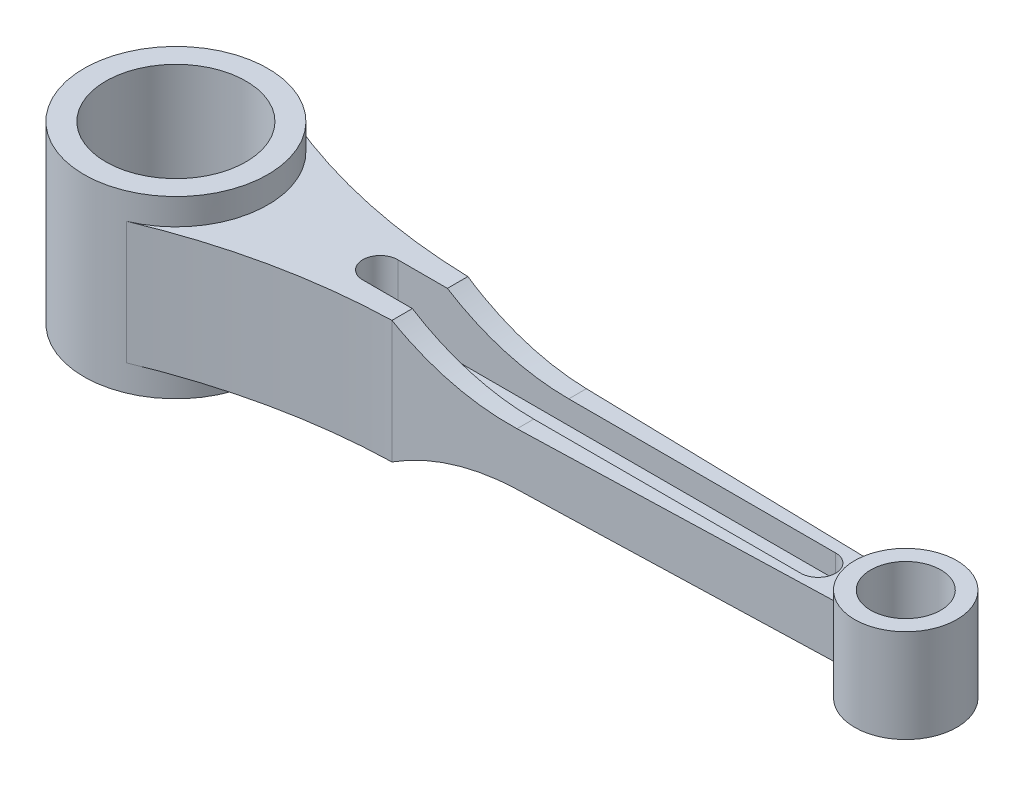
ISO-10303-21;
HEADER;
FILE_DESCRIPTION(('STEP AP214'),'2;1');
FILE_NAME('part.step','',(''),(''),'','','');
FILE_SCHEMA(('AUTOMOTIVE_DESIGN { 1 0 10303 214 1 1 1 1 }'));
ENDSEC;
DATA;
#1=APPLICATION_CONTEXT('core data for automotive mechanical design processes');
#2=APPLICATION_PROTOCOL_DEFINITION('international standard','automotive_design',2000,#1);
#3=PRODUCT_CONTEXT('',#1,'mechanical');
#4=PRODUCT('Part','Part','',(#3));
#5=PRODUCT_RELATED_PRODUCT_CATEGORY('part','',(#4));
#6=PRODUCT_DEFINITION_FORMATION('','',#4);
#7=PRODUCT_DEFINITION_CONTEXT('part definition',#1,'design');
#8=PRODUCT_DEFINITION('design','',#6,#7);
#9=PRODUCT_DEFINITION_SHAPE('','',#8);
#10=(LENGTH_UNIT() NAMED_UNIT(*) SI_UNIT(.MILLI.,.METRE.));
#11=(NAMED_UNIT(*) PLANE_ANGLE_UNIT() SI_UNIT($,.RADIAN.));
#12=(NAMED_UNIT(*) SI_UNIT($,.STERADIAN.) SOLID_ANGLE_UNIT());
#13=UNCERTAINTY_MEASURE_WITH_UNIT(LENGTH_MEASURE(1.E-05),#10,'distance_accuracy_value','');
#14=(GEOMETRIC_REPRESENTATION_CONTEXT(3) GLOBAL_UNCERTAINTY_ASSIGNED_CONTEXT((#13)) GLOBAL_UNIT_ASSIGNED_CONTEXT((#10,
#11,#12)) REPRESENTATION_CONTEXT('',''));
#15=CARTESIAN_POINT('',(0.,0.,0.));
#16=DIRECTION('',(0.,0.,1.));
#17=DIRECTION('',(1.,0.,0.));
#18=AXIS2_PLACEMENT_3D('',#15,#16,#17);
#19=CARTESIAN_POINT('',(0.,9.,-6.));
#20=DIRECTION('',(0.,0.,-1.));
#21=DIRECTION('',(-1.,0.,0.));
#22=AXIS2_PLACEMENT_3D('',#19,#20,#21);
#23=PLANE('',#22);
#24=DIRECTION('',(1.,0.,0.));
#25=VECTOR('',#24,1.);
#26=CARTESIAN_POINT('',(0.,-1.05,-6.));
#27=LINE('',#26,#25);
#28=CARTESIAN_POINT('',(0.,-1.05,-6.));
#29=VERTEX_POINT('',#28);
#30=CARTESIAN_POINT('',(150.,-1.05,-6.));
#31=VERTEX_POINT('',#30);
#32=EDGE_CURVE('E224',#29,#31,#27,.T.);
#33=ORIENTED_EDGE('',*,*,#32,.F.);
#34=DIRECTION('',(0.,-1.,0.));
#35=VECTOR('',#34,1.);
#36=CARTESIAN_POINT('',(0.,21.,-6.));
#37=LINE('',#36,#35);
#38=CARTESIAN_POINT('',(0.,-21.,-6.));
#39=VERTEX_POINT('',#38);
#40=EDGE_CURVE('E282',#29,#39,#37,.T.);
#41=ORIENTED_EDGE('',*,*,#40,.T.);
#42=DIRECTION('',(1.,0.,0.));
#43=VECTOR('',#42,1.);
#44=CARTESIAN_POINT('',(0.,-21.,-6.));
#45=LINE('',#44,#43);
#46=CARTESIAN_POINT('',(17.,-21.,-6.));
#47=VERTEX_POINT('',#46);
#48=EDGE_CURVE('E272',#39,#47,#45,.T.);
#49=ORIENTED_EDGE('',*,*,#48,.T.);
#50=CARTESIAN_POINT('',(58.5692193816531,-87.,-6.));
#51=DIRECTION('',(0.,0.,-1.));
#52=DIRECTION('',(-1.,0.,0.));
#53=AXIS2_PLACEMENT_3D('',#50,#51,#52);
#54=CIRCLE('',#53,78.);
#55=CARTESIAN_POINT('',(58.5692193816531,-9.,-6.));
#56=VERTEX_POINT('',#55);
#57=EDGE_CURVE('E402',#47,#56,#54,.T.);
#58=ORIENTED_EDGE('',*,*,#57,.T.);
#59=DIRECTION('',(1.,0.,0.));
#60=VECTOR('',#59,1.);
#61=CARTESIAN_POINT('',(0.,-9.,-6.));
#62=LINE('',#61,#60);
#63=CARTESIAN_POINT('',(150.,-9.,-6.));
#64=VERTEX_POINT('',#63);
#65=EDGE_CURVE('E334',#56,#64,#62,.T.);
#66=ORIENTED_EDGE('',*,*,#65,.T.);
#67=DIRECTION('',(0.,-1.,0.));
#68=VECTOR('',#67,1.);
#69=CARTESIAN_POINT('',(150.,9.,-6.));
#70=LINE('',#69,#68);
#71=EDGE_CURVE('E354',#31,#64,#70,.T.);
#72=ORIENTED_EDGE('',*,*,#71,.F.);
#73=EDGE_LOOP('',(#33,#41,#49,#58,#66,#72));
#74=FACE_BOUND('',#73,.T.);
#75=ADVANCED_FACE('F45',(#74),#23,.F.);
#76=CARTESIAN_POINT('',(150.,9.,0.));
#77=DIRECTION('',(0.,-1.,0.));
#78=DIRECTION('',(0.,0.,-1.));
#79=AXIS2_PLACEMENT_3D('',#76,#77,#78);
#80=CYLINDRICAL_SURFACE('',#79,6.);
#81=DIRECTION('',(0.,-1.,0.));
#82=VECTOR('',#81,1.);
#83=CARTESIAN_POINT('',(150.,9.,6.));
#84=LINE('',#83,#82);
#85=CARTESIAN_POINT('',(150.,-1.05,6.));
#86=VERTEX_POINT('',#85);
#87=CARTESIAN_POINT('',(150.,-9.,6.));
#88=VERTEX_POINT('',#87);
#89=EDGE_CURVE('E351',#86,#88,#84,.T.);
#90=ORIENTED_EDGE('',*,*,#89,.F.);
#91=CARTESIAN_POINT('',(150.,-1.05,0.));
#92=DIRECTION('',(0.,1.,0.));
#93=DIRECTION('',(0.,0.,1.));
#94=AXIS2_PLACEMENT_3D('',#91,#92,#93);
#95=CIRCLE('',#94,6.);
#96=EDGE_CURVE('E220',#86,#31,#95,.T.);
#97=ORIENTED_EDGE('',*,*,#96,.T.);
#98=ORIENTED_EDGE('',*,*,#71,.T.);
#99=CARTESIAN_POINT('',(150.,-9.,0.));
#100=DIRECTION('',(0.,1.,0.));
#101=DIRECTION('',(0.,0.,1.));
#102=AXIS2_PLACEMENT_3D('',#99,#100,#101);
#103=CIRCLE('',#102,6.);
#104=EDGE_CURVE('E337',#88,#64,#103,.T.);
#105=ORIENTED_EDGE('',*,*,#104,.F.);
#106=EDGE_LOOP('',(#90,#97,#98,#105));
#107=FACE_BOUND('',#106,.T.);
#108=ADVANCED_FACE('F458',(#107),#80,.F.);
#109=CARTESIAN_POINT('',(0.,9.,6.));
#110=DIRECTION('',(0.,0.,-1.));
#111=DIRECTION('',(-1.,0.,0.));
#112=AXIS2_PLACEMENT_3D('',#109,#110,#111);
#113=PLANE('',#112);
#114=DIRECTION('',(0.,-1.,0.));
#115=VECTOR('',#114,1.);
#116=CARTESIAN_POINT('',(0.,21.,6.));
#117=LINE('',#116,#115);
#118=CARTESIAN_POINT('',(0.,-1.04999999999999,6.));
#119=VERTEX_POINT('',#118);
#120=CARTESIAN_POINT('',(0.,-21.,6.));
#121=VERTEX_POINT('',#120);
#122=EDGE_CURVE('E189',#119,#121,#117,.T.);
#123=ORIENTED_EDGE('',*,*,#122,.F.);
#124=DIRECTION('',(1.,0.,0.));
#125=VECTOR('',#124,1.);
#126=CARTESIAN_POINT('',(0.,-1.05,6.));
#127=LINE('',#126,#125);
#128=EDGE_CURVE('E216',#119,#86,#127,.T.);
#129=ORIENTED_EDGE('',*,*,#128,.T.);
#130=ORIENTED_EDGE('',*,*,#89,.T.);
#131=DIRECTION('',(1.,0.,0.));
#132=VECTOR('',#131,1.);
#133=CARTESIAN_POINT('',(0.,-9.,6.));
#134=LINE('',#133,#132);
#135=CARTESIAN_POINT('',(58.5692193816531,-9.,6.));
#136=VERTEX_POINT('',#135);
#137=EDGE_CURVE('E341',#136,#88,#134,.T.);
#138=ORIENTED_EDGE('',*,*,#137,.F.);
#139=CARTESIAN_POINT('',(58.5692193816531,-87.,6.));
#140=DIRECTION('',(0.,0.,-1.));
#141=DIRECTION('',(-1.,0.,0.));
#142=AXIS2_PLACEMENT_3D('',#139,#140,#141);
#143=CIRCLE('',#142,78.);
#144=CARTESIAN_POINT('',(17.,-21.,6.));
#145=VERTEX_POINT('',#144);
#146=EDGE_CURVE('E399',#136,#145,#143,.F.);
#147=ORIENTED_EDGE('',*,*,#146,.T.);
#148=DIRECTION('',(1.,0.,0.));
#149=VECTOR('',#148,1.);
#150=CARTESIAN_POINT('',(0.,-21.,6.));
#151=LINE('',#150,#149);
#152=EDGE_CURVE('E263',#121,#145,#151,.T.);
#153=ORIENTED_EDGE('',*,*,#152,.F.);
#154=EDGE_LOOP('',(#123,#129,#130,#138,#147,#153));
#155=FACE_BOUND('',#154,.T.);
#156=ADVANCED_FACE('F467',(#155),#113,.T.);
#157=CARTESIAN_POINT('',(0.,21.,0.));
#158=DIRECTION('',(0.,-1.,0.));
#159=DIRECTION('',(0.,0.,-1.));
#160=AXIS2_PLACEMENT_3D('',#157,#158,#159);
#161=CYLINDRICAL_SURFACE('',#160,6.);
#162=ORIENTED_EDGE('',*,*,#40,.F.);
#163=CARTESIAN_POINT('',(0.,-1.05,0.));
#164=DIRECTION('',(0.,1.,0.));
#165=DIRECTION('',(0.,0.,1.));
#166=AXIS2_PLACEMENT_3D('',#163,#164,#165);
#167=CIRCLE('',#166,6.);
#168=EDGE_CURVE('E201',#29,#119,#167,.T.);
#169=ORIENTED_EDGE('',*,*,#168,.T.);
#170=ORIENTED_EDGE('',*,*,#122,.T.);
#171=CARTESIAN_POINT('',(0.,-21.,0.));
#172=DIRECTION('',(0.,1.,0.));
#173=DIRECTION('',(0.,0.,1.));
#174=AXIS2_PLACEMENT_3D('',#171,#172,#173);
#175=CIRCLE('',#174,6.);
#176=EDGE_CURVE('E268',#39,#121,#175,.T.);
#177=ORIENTED_EDGE('',*,*,#176,.F.);
#178=EDGE_LOOP('',(#162,#169,#170,#177));
#179=FACE_BOUND('',#178,.T.);
#180=ADVANCED_FACE('F471',(#179),#161,.F.);
#181=CARTESIAN_POINT('',(180.,-16.,0.));
#182=DIRECTION('',(0.,1.,0.));
#183=DIRECTION('',(0.,0.,1.));
#184=AXIS2_PLACEMENT_3D('',#181,#182,#183);
#185=CYLINDRICAL_SURFACE('',#184,12.);
#186=CARTESIAN_POINT('',(180.,-16.,0.));
#187=DIRECTION('',(0.,1.,0.));
#188=DIRECTION('',(0.,0.,1.));
#189=AXIS2_PLACEMENT_3D('',#186,#187,#188);
#190=CIRCLE('',#189,12.);
#191=CARTESIAN_POINT('',(180.,-16.,12.));
#192=VERTEX_POINT('',#191);
#193=EDGE_CURVE('E367',#192,#192,#190,.T.);
#194=ORIENTED_EDGE('',*,*,#193,.F.);
#195=EDGE_LOOP('',(#194));
#196=FACE_BOUND('',#195,.T.);
#197=CARTESIAN_POINT('',(180.,16.,0.));
#198=DIRECTION('',(0.,1.,0.));
#199=DIRECTION('',(0.,0.,1.));
#200=AXIS2_PLACEMENT_3D('',#197,#198,#199);
#201=CIRCLE('',#200,12.);
#202=CARTESIAN_POINT('',(180.,16.,12.));
#203=VERTEX_POINT('',#202);
#204=EDGE_CURVE('E366',#203,#203,#201,.T.);
#205=ORIENTED_EDGE('',*,*,#204,.T.);
#206=EDGE_LOOP('',(#205));
#207=FACE_BOUND('',#206,.T.);
#208=ADVANCED_FACE('F535',(#196,#207),#185,.F.);
#209=CARTESIAN_POINT('',(180.,-16.,0.));
#210=DIRECTION('',(0.,1.,0.));
#211=DIRECTION('',(0.,0.,1.));
#212=AXIS2_PLACEMENT_3D('',#209,#210,#211);
#213=CYLINDRICAL_SURFACE('',#212,17.5);
#214=CARTESIAN_POINT('',(180.,9.,0.));
#215=DIRECTION('',(0.,1.,0.));
#216=DIRECTION('',(0.,0.,1.));
#217=AXIS2_PLACEMENT_3D('',#214,#215,#216);
#218=CIRCLE('',#217,17.5);
#219=CARTESIAN_POINT('',(165.332573431166,9.,-9.54550144559515));
#220=VERTEX_POINT('',#219);
#221=CARTESIAN_POINT('',(164.677746438805,9.,8.45449855440485));
#222=VERTEX_POINT('',#221);
#223=EDGE_CURVE('E306',#220,#222,#218,.T.);
#224=ORIENTED_EDGE('',*,*,#223,.T.);
#225=DIRECTION('',(0.,-1.,0.));
#226=VECTOR('',#225,1.);
#227=CARTESIAN_POINT('',(164.677746438805,9.,8.45449855440485));
#228=LINE('',#227,#226);
#229=CARTESIAN_POINT('',(164.677746438805,-9.,8.45449855440485));
#230=VERTEX_POINT('',#229);
#231=EDGE_CURVE('E327',#222,#230,#228,.T.);
#232=ORIENTED_EDGE('',*,*,#231,.T.);
#233=CARTESIAN_POINT('',(180.,-9.,0.));
#234=DIRECTION('',(0.,1.,0.));
#235=DIRECTION('',(0.,0.,1.));
#236=AXIS2_PLACEMENT_3D('',#233,#234,#235);
#237=CIRCLE('',#236,17.5);
#238=CARTESIAN_POINT('',(165.332573431166,-9.,-9.54550144559516));
#239=VERTEX_POINT('',#238);
#240=EDGE_CURVE('E299',#239,#230,#237,.T.);
#241=ORIENTED_EDGE('',*,*,#240,.F.);
#242=DIRECTION('',(0.,-1.,0.));
#243=VECTOR('',#242,1.);
#244=CARTESIAN_POINT('',(165.332573431166,9.,-9.54550144559515));
#245=LINE('',#244,#243);
#246=EDGE_CURVE('E362',#220,#239,#245,.T.);
#247=ORIENTED_EDGE('',*,*,#246,.F.);
#248=EDGE_LOOP('',(#224,#232,#241,#247));
#249=FACE_BOUND('',#248,.T.);
#250=CARTESIAN_POINT('',(180.,-16.,0.));
#251=DIRECTION('',(0.,1.,0.));
#252=DIRECTION('',(0.,0.,1.));
#253=AXIS2_PLACEMENT_3D('',#250,#251,#252);
#254=CIRCLE('',#253,17.5);
#255=CARTESIAN_POINT('',(180.,-16.,17.5));
#256=VERTEX_POINT('',#255);
#257=EDGE_CURVE('E371',#256,#256,#254,.T.);
#258=ORIENTED_EDGE('',*,*,#257,.T.);
#259=EDGE_LOOP('',(#258));
#260=FACE_BOUND('',#259,.T.);
#261=CARTESIAN_POINT('',(180.,16.,0.));
#262=DIRECTION('',(0.,1.,0.));
#263=DIRECTION('',(0.,0.,1.));
#264=AXIS2_PLACEMENT_3D('',#261,#262,#263);
#265=CIRCLE('',#264,17.5);
#266=CARTESIAN_POINT('',(180.,16.,17.5));
#267=VERTEX_POINT('',#266);
#268=EDGE_CURVE('E372',#267,#267,#265,.T.);
#269=ORIENTED_EDGE('',*,*,#268,.F.);
#270=EDGE_LOOP('',(#269));
#271=FACE_BOUND('',#270,.T.);
#272=ADVANCED_FACE('F494',(#249,#260,#271),#213,.T.);
#273=CARTESIAN_POINT('',(0.,-16.,0.));
#274=DIRECTION('',(0.,1.,0.));
#275=DIRECTION('',(0.,0.,1.));
#276=AXIS2_PLACEMENT_3D('',#273,#274,#275);
#277=PLANE('',#276);
#278=ORIENTED_EDGE('',*,*,#193,.T.);
#279=EDGE_LOOP('',(#278));
#280=FACE_BOUND('',#279,.T.);
#281=ORIENTED_EDGE('',*,*,#257,.F.);
#282=EDGE_LOOP('',(#281));
#283=FACE_BOUND('',#282,.T.);
#284=ADVANCED_FACE('F526',(#280,#283),#277,.F.);
#285=CARTESIAN_POINT('',(0.,16.,0.));
#286=DIRECTION('',(0.,1.,0.));
#287=DIRECTION('',(0.,0.,1.));
#288=AXIS2_PLACEMENT_3D('',#285,#286,#287);
#289=PLANE('',#288);
#290=ORIENTED_EDGE('',*,*,#204,.F.);
#291=EDGE_LOOP('',(#290));
#292=FACE_BOUND('',#291,.T.);
#293=ORIENTED_EDGE('',*,*,#268,.T.);
#294=EDGE_LOOP('',(#293));
#295=FACE_BOUND('',#294,.T.);
#296=ADVANCED_FACE('F525',(#292,#295),#289,.T.);
#297=CARTESIAN_POINT('',(0.311806559630591,9.,-13.388649227758));
#298=DIRECTION('',(0.0232825605624481,0.,-0.99972892444585));
#299=DIRECTION('',(-0.99972892444585,0.,-0.0232825605624481));
#300=AXIS2_PLACEMENT_3D('',#297,#298,#299);
#301=PLANE('',#300);
#302=DIRECTION('',(0.99972892444585,0.,0.0232825605624481));
#303=VECTOR('',#302,1.);
#304=CARTESIAN_POINT('',(0.311806559630591,-9.,-13.388649227758));
#305=LINE('',#304,#303);
#306=CARTESIAN_POINT('',(58.5692193816531,-9.,-12.0318997038887));
#307=VERTEX_POINT('',#306);
#308=EDGE_CURVE('E331',#307,#239,#305,.T.);
#309=ORIENTED_EDGE('',*,*,#308,.F.);
#310=CARTESIAN_POINT('',(58.5692193816531,-87.,-12.0318997038887));
#311=DIRECTION('',(0.0232825605624481,0.,-0.99972892444585));
#312=DIRECTION('',(0.99972892444585,0.,0.0232825605624481));
#313=AXIS2_PLACEMENT_3D('',#310,#311,#312);
#314=ELLIPSE('',#313,78.0211496263704,78.);
#315=CARTESIAN_POINT('',(17.,-21.,-13.));
#316=VERTEX_POINT('',#315);
#317=EDGE_CURVE('E405',#307,#316,#314,.F.);
#318=ORIENTED_EDGE('',*,*,#317,.T.);
#319=DIRECTION('',(0.,-1.,0.));
#320=VECTOR('',#319,1.);
#321=CARTESIAN_POINT('',(17.,9.,-13.));
#322=LINE('',#321,#320);
#323=CARTESIAN_POINT('',(17.,21.,-13.));
#324=VERTEX_POINT('',#323);
#325=EDGE_CURVE('E359',#324,#316,#322,.T.);
#326=ORIENTED_EDGE('',*,*,#325,.F.);
#327=CARTESIAN_POINT('',(58.5692193816531,87.,-12.0318997038887));
#328=DIRECTION('',(0.0232825605624481,0.,-0.99972892444585));
#329=DIRECTION('',(0.99972892444585,0.,0.0232825605624481));
#330=AXIS2_PLACEMENT_3D('',#327,#328,#329);
#331=ELLIPSE('',#330,78.0211496263704,78.);
#332=CARTESIAN_POINT('',(58.5692193816531,9.,-12.0318997038887));
#333=VERTEX_POINT('',#332);
#334=EDGE_CURVE('E11',#324,#333,#331,.F.);
#335=ORIENTED_EDGE('',*,*,#334,.T.);
#336=DIRECTION('',(0.99972892444585,0.,0.0232825605624481));
#337=VECTOR('',#336,1.);
#338=CARTESIAN_POINT('',(0.311806559630591,9.,-13.388649227758));
#339=LINE('',#338,#337);
#340=EDGE_CURVE('E310',#333,#220,#339,.T.);
#341=ORIENTED_EDGE('',*,*,#340,.T.);
#342=ORIENTED_EDGE('',*,*,#246,.T.);
#343=EDGE_LOOP('',(#309,#318,#326,#335,#341,#342));
#344=FACE_BOUND('',#343,.T.);
#345=ADVANCED_FACE('F488',(#344),#301,.T.);
#346=CARTESIAN_POINT('',(0.,21.,-6.));
#347=VERTEX_POINT('',#346);
#348=CARTESIAN_POINT('',(0.,1.05000000000001,-6.));
#349=VERTEX_POINT('',#348);
#350=EDGE_CURVE('E283',#347,#349,#37,.T.);
#351=ORIENTED_EDGE('',*,*,#350,.T.);
#352=DIRECTION('',(1.,0.,0.));
#353=VECTOR('',#352,1.);
#354=CARTESIAN_POINT('',(0.,1.05,-6.));
#355=LINE('',#354,#353);
#356=CARTESIAN_POINT('',(150.,1.05,-6.));
#357=VERTEX_POINT('',#356);
#358=EDGE_CURVE('E205',#349,#357,#355,.T.);
#359=ORIENTED_EDGE('',*,*,#358,.T.);
#360=CARTESIAN_POINT('',(150.,9.,-6.));
#361=VERTEX_POINT('',#360);
#362=EDGE_CURVE('E355',#361,#357,#70,.T.);
#363=ORIENTED_EDGE('',*,*,#362,.F.);
#364=DIRECTION('',(1.,0.,0.));
#365=VECTOR('',#364,1.);
#366=CARTESIAN_POINT('',(0.,9.,-6.));
#367=LINE('',#366,#365);
#368=CARTESIAN_POINT('',(58.5692193816531,9.,-6.));
#369=VERTEX_POINT('',#368);
#370=EDGE_CURVE('E314',#369,#361,#367,.T.);
#371=ORIENTED_EDGE('',*,*,#370,.F.);
#372=CARTESIAN_POINT('',(58.5692193816531,87.,-6.));
#373=DIRECTION('',(0.,0.,-1.));
#374=DIRECTION('',(-1.,0.,0.));
#375=AXIS2_PLACEMENT_3D('',#372,#373,#374);
#376=CIRCLE('',#375,78.);
#377=CARTESIAN_POINT('',(17.,21.,-6.));
#378=VERTEX_POINT('',#377);
#379=EDGE_CURVE('E55',#369,#378,#376,.T.);
#380=ORIENTED_EDGE('',*,*,#379,.T.);
#381=DIRECTION('',(1.,0.,0.));
#382=VECTOR('',#381,1.);
#383=CARTESIAN_POINT('',(0.,21.,-6.));
#384=LINE('',#383,#382);
#385=EDGE_CURVE('E248',#347,#378,#384,.T.);
#386=ORIENTED_EDGE('',*,*,#385,.F.);
#387=EDGE_LOOP('',(#351,#359,#363,#371,#380,#386));
#388=FACE_BOUND('',#387,.T.);
#389=ADVANCED_FACE('F419',(#388),#23,.F.);
#390=CARTESIAN_POINT('',(150.,1.05,0.));
#391=DIRECTION('',(0.,1.,0.));
#392=DIRECTION('',(0.,0.,1.));
#393=AXIS2_PLACEMENT_3D('',#390,#391,#392);
#394=CIRCLE('',#393,6.);
#395=CARTESIAN_POINT('',(150.,1.05,6.));
#396=VERTEX_POINT('',#395);
#397=EDGE_CURVE('E200',#396,#357,#394,.T.);
#398=ORIENTED_EDGE('',*,*,#397,.F.);
#399=CARTESIAN_POINT('',(150.,9.,6.));
#400=VERTEX_POINT('',#399);
#401=EDGE_CURVE('E196',#400,#396,#84,.T.);
#402=ORIENTED_EDGE('',*,*,#401,.F.);
#403=CARTESIAN_POINT('',(150.,9.,0.));
#404=DIRECTION('',(0.,1.,0.));
#405=DIRECTION('',(0.,0.,1.));
#406=AXIS2_PLACEMENT_3D('',#403,#404,#405);
#407=CIRCLE('',#406,6.);
#408=EDGE_CURVE('E317',#400,#361,#407,.T.);
#409=ORIENTED_EDGE('',*,*,#408,.T.);
#410=ORIENTED_EDGE('',*,*,#362,.T.);
#411=EDGE_LOOP('',(#398,#402,#409,#410));
#412=FACE_BOUND('',#411,.T.);
#413=ADVANCED_FACE('F508',(#412),#80,.F.);
#414=DIRECTION('',(1.,0.,0.));
#415=VECTOR('',#414,1.);
#416=CARTESIAN_POINT('',(0.,1.05,6.));
#417=LINE('',#416,#415);
#418=CARTESIAN_POINT('',(0.,1.05,6.));
#419=VERTEX_POINT('',#418);
#420=EDGE_CURVE('E193',#419,#396,#417,.T.);
#421=ORIENTED_EDGE('',*,*,#420,.F.);
#422=CARTESIAN_POINT('',(0.,21.,6.));
#423=VERTEX_POINT('',#422);
#424=EDGE_CURVE('E176',#423,#419,#117,.T.);
#425=ORIENTED_EDGE('',*,*,#424,.F.);
#426=DIRECTION('',(1.,0.,0.));
#427=VECTOR('',#426,1.);
#428=CARTESIAN_POINT('',(0.,21.,6.));
#429=LINE('',#428,#427);
#430=CARTESIAN_POINT('',(17.,21.,6.));
#431=VERTEX_POINT('',#430);
#432=EDGE_CURVE('E242',#423,#431,#429,.T.);
#433=ORIENTED_EDGE('',*,*,#432,.T.);
#434=CARTESIAN_POINT('',(58.5692193816531,87.,6.));
#435=DIRECTION('',(0.,0.,-1.));
#436=DIRECTION('',(-1.,0.,0.));
#437=AXIS2_PLACEMENT_3D('',#434,#435,#436);
#438=CIRCLE('',#437,78.);
#439=CARTESIAN_POINT('',(58.5692193816531,9.,6.));
#440=VERTEX_POINT('',#439);
#441=EDGE_CURVE('E413',#431,#440,#438,.F.);
#442=ORIENTED_EDGE('',*,*,#441,.T.);
#443=DIRECTION('',(1.,0.,0.));
#444=VECTOR('',#443,1.);
#445=CARTESIAN_POINT('',(0.,9.,6.));
#446=LINE('',#445,#444);
#447=EDGE_CURVE('E321',#440,#400,#446,.T.);
#448=ORIENTED_EDGE('',*,*,#447,.T.);
#449=ORIENTED_EDGE('',*,*,#401,.T.);
#450=EDGE_LOOP('',(#421,#425,#433,#442,#448,#449));
#451=FACE_BOUND('',#450,.T.);
#452=ADVANCED_FACE('F194',(#451),#113,.T.);
#453=CARTESIAN_POINT('',(0.415850103012375,9.,13.5104579339038));
#454=DIRECTION('',(-0.0307652972728992,0.,-0.999526636205214));
#455=DIRECTION('',(-0.999526636205214,0.,0.0307652972728992));
#456=AXIS2_PLACEMENT_3D('',#453,#454,#455);
#457=PLANE('',#456);
#458=DIRECTION('',(0.,-1.,0.));
#459=VECTOR('',#458,1.);
#460=CARTESIAN_POINT('',(17.,9.,13.));
#461=LINE('',#460,#459);
#462=CARTESIAN_POINT('',(17.,21.,13.));
#463=VERTEX_POINT('',#462);
#464=CARTESIAN_POINT('',(17.,-21.,13.));
#465=VERTEX_POINT('',#464);
#466=EDGE_CURVE('E62',#463,#465,#461,.T.);
#467=ORIENTED_EDGE('',*,*,#466,.T.);
#468=CARTESIAN_POINT('',(58.5692193816531,-87.,11.7205049416849));
#469=DIRECTION('',(-0.0307652972728992,0.,-0.999526636205214));
#470=DIRECTION('',(-0.999526636205214,0.,0.0307652972728992));
#471=AXIS2_PLACEMENT_3D('',#468,#469,#470);
#472=ELLIPSE('',#471,78.0369398619866,78.);
#473=CARTESIAN_POINT('',(58.5692193816531,-9.,11.7205049416849));
#474=VERTEX_POINT('',#473);
#475=EDGE_CURVE('E396',#465,#474,#472,.T.);
#476=ORIENTED_EDGE('',*,*,#475,.T.);
#477=DIRECTION('',(0.999526636205214,0.,-0.0307652972728992));
#478=VECTOR('',#477,1.);
#479=CARTESIAN_POINT('',(0.415850103012375,-9.,13.5104579339038));
#480=LINE('',#479,#478);
#481=EDGE_CURVE('E311',#474,#230,#480,.T.);
#482=ORIENTED_EDGE('',*,*,#481,.T.);
#483=ORIENTED_EDGE('',*,*,#231,.F.);
#484=DIRECTION('',(0.999526636205214,0.,-0.0307652972728992));
#485=VECTOR('',#484,1.);
#486=CARTESIAN_POINT('',(0.415850103012375,9.,13.5104579339038));
#487=LINE('',#486,#485);
#488=CARTESIAN_POINT('',(58.5692193816531,9.,11.7205049416849));
#489=VERTEX_POINT('',#488);
#490=EDGE_CURVE('E324',#489,#222,#487,.T.);
#491=ORIENTED_EDGE('',*,*,#490,.F.);
#492=CARTESIAN_POINT('',(58.5692193816531,87.,11.7205049416849));
#493=DIRECTION('',(-0.0307652972728992,0.,-0.999526636205214));
#494=DIRECTION('',(-0.999526636205214,0.,0.0307652972728992));
#495=AXIS2_PLACEMENT_3D('',#492,#493,#494);
#496=ELLIPSE('',#495,78.0369398619866,78.);
#497=EDGE_CURVE('E409',#489,#463,#496,.T.);
#498=ORIENTED_EDGE('',*,*,#497,.T.);
#499=EDGE_LOOP('',(#467,#476,#482,#483,#491,#498));
#500=FACE_BOUND('',#499,.T.);
#501=ADVANCED_FACE('F498',(#500),#457,.F.);
#502=CARTESIAN_POINT('',(0.,9.,0.));
#503=DIRECTION('',(0.,1.,0.));
#504=DIRECTION('',(0.,0.,1.));
#505=AXIS2_PLACEMENT_3D('',#502,#503,#504);
#506=PLANE('',#505);
#507=ORIENTED_EDGE('',*,*,#447,.F.);
#508=DIRECTION('',(0.,0.,-1.));
#509=VECTOR('',#508,1.);
#510=CARTESIAN_POINT('',(58.5692193816531,9.,13.));
#511=LINE('',#510,#509);
#512=EDGE_CURVE('E392',#440,#489,#511,.F.);
#513=ORIENTED_EDGE('',*,*,#512,.T.);
#514=ORIENTED_EDGE('',*,*,#490,.T.);
#515=ORIENTED_EDGE('',*,*,#223,.F.);
#516=ORIENTED_EDGE('',*,*,#340,.F.);
#517=DIRECTION('',(0.,0.,-1.));
#518=VECTOR('',#517,1.);
#519=CARTESIAN_POINT('',(58.5692193816531,9.,-6.));
#520=LINE('',#519,#518);
#521=EDGE_CURVE('E388',#333,#369,#520,.F.);
#522=ORIENTED_EDGE('',*,*,#521,.T.);
#523=ORIENTED_EDGE('',*,*,#370,.T.);
#524=ORIENTED_EDGE('',*,*,#408,.F.);
#525=EDGE_LOOP('',(#507,#513,#514,#515,#516,#522,#523,#524));
#526=FACE_BOUND('',#525,.T.);
#527=ADVANCED_FACE('F501',(#526),#506,.T.);
#528=CARTESIAN_POINT('',(0.,-9.,0.));
#529=DIRECTION('',(0.,1.,0.));
#530=DIRECTION('',(0.,0.,1.));
#531=AXIS2_PLACEMENT_3D('',#528,#529,#530);
#532=PLANE('',#531);
#533=ORIENTED_EDGE('',*,*,#481,.F.);
#534=DIRECTION('',(0.,0.,1.));
#535=VECTOR('',#534,1.);
#536=CARTESIAN_POINT('',(58.5692193816531,-9.,0.));
#537=LINE('',#536,#535);
#538=EDGE_CURVE('E385',#474,#136,#537,.F.);
#539=ORIENTED_EDGE('',*,*,#538,.T.);
#540=ORIENTED_EDGE('',*,*,#137,.T.);
#541=ORIENTED_EDGE('',*,*,#104,.T.);
#542=ORIENTED_EDGE('',*,*,#65,.F.);
#543=DIRECTION('',(0.,0.,1.));
#544=VECTOR('',#543,1.);
#545=CARTESIAN_POINT('',(58.5692193816531,-9.,0.));
#546=LINE('',#545,#544);
#547=EDGE_CURVE('E376',#56,#307,#546,.F.);
#548=ORIENTED_EDGE('',*,*,#547,.T.);
#549=ORIENTED_EDGE('',*,*,#308,.T.);
#550=ORIENTED_EDGE('',*,*,#240,.T.);
#551=EDGE_LOOP('',(#533,#539,#540,#541,#542,#548,#549,#550));
#552=FACE_BOUND('',#551,.T.);
#553=ADVANCED_FACE('F461',(#552),#532,.F.);
#554=CARTESIAN_POINT('',(-70.,-30.,0.));
#555=DIRECTION('',(0.,1.,0.));
#556=DIRECTION('',(0.,0.,1.));
#557=AXIS2_PLACEMENT_3D('',#554,#555,#556);
#558=CYLINDRICAL_SURFACE('',#557,24.);
#559=CARTESIAN_POINT('',(-70.,-30.,0.));
#560=DIRECTION('',(0.,1.,0.));
#561=DIRECTION('',(0.,0.,1.));
#562=AXIS2_PLACEMENT_3D('',#559,#560,#561);
#563=CIRCLE('',#562,24.);
#564=CARTESIAN_POINT('',(-70.,-30.,24.));
#565=VERTEX_POINT('',#564);
#566=EDGE_CURVE('E290',#565,#565,#563,.T.);
#567=ORIENTED_EDGE('',*,*,#566,.F.);
#568=EDGE_LOOP('',(#567));
#569=FACE_BOUND('',#568,.T.);
#570=CARTESIAN_POINT('',(-70.,30.,0.));
#571=DIRECTION('',(0.,1.,0.));
#572=DIRECTION('',(0.,0.,1.));
#573=AXIS2_PLACEMENT_3D('',#570,#571,#572);
#574=CIRCLE('',#573,24.);
#575=CARTESIAN_POINT('',(-70.,30.,24.));
#576=VERTEX_POINT('',#575);
#577=EDGE_CURVE('E289',#576,#576,#574,.T.);
#578=ORIENTED_EDGE('',*,*,#577,.T.);
#579=EDGE_LOOP('',(#578));
#580=FACE_BOUND('',#579,.T.);
#581=ADVANCED_FACE('F618',(#569,#580),#558,.F.);
#582=CARTESIAN_POINT('',(-70.,-30.,0.));
#583=DIRECTION('',(0.,1.,0.));
#584=DIRECTION('',(0.,0.,1.));
#585=AXIS2_PLACEMENT_3D('',#582,#583,#584);
#586=CYLINDRICAL_SURFACE('',#585,31.5);
#587=CARTESIAN_POINT('',(-70.,21.,0.));
#588=DIRECTION('',(0.,1.,0.));
#589=DIRECTION('',(0.,0.,1.));
#590=AXIS2_PLACEMENT_3D('',#587,#588,#589);
#591=CIRCLE('',#590,31.5);
#592=CARTESIAN_POINT('',(-57.8377166443081,21.,29.0573375169829));
#593=VERTEX_POINT('',#592);
#594=CARTESIAN_POINT('',(-57.8377166443081,21.,-29.0573375169829));
#595=VERTEX_POINT('',#594);
#596=EDGE_CURVE('E230',#593,#595,#591,.T.);
#597=ORIENTED_EDGE('',*,*,#596,.T.);
#598=DIRECTION('',(0.,-1.,0.));
#599=VECTOR('',#598,1.);
#600=CARTESIAN_POINT('',(-57.8377166443081,21.,-29.0573375169829));
#601=LINE('',#600,#599);
#602=CARTESIAN_POINT('',(-57.8377166443081,-21.,-29.0573375169829));
#603=VERTEX_POINT('',#602);
#604=EDGE_CURVE('E255',#595,#603,#601,.T.);
#605=ORIENTED_EDGE('',*,*,#604,.T.);
#606=CARTESIAN_POINT('',(-70.,-21.,0.));
#607=DIRECTION('',(0.,1.,0.));
#608=DIRECTION('',(0.,0.,1.));
#609=AXIS2_PLACEMENT_3D('',#606,#607,#608);
#610=CIRCLE('',#609,31.5);
#611=CARTESIAN_POINT('',(-57.8377166443081,-21.,29.0573375169829));
#612=VERTEX_POINT('',#611);
#613=EDGE_CURVE('E207',#612,#603,#610,.T.);
#614=ORIENTED_EDGE('',*,*,#613,.F.);
#615=DIRECTION('',(0.,-1.,0.));
#616=VECTOR('',#615,1.);
#617=CARTESIAN_POINT('',(-57.8377166443081,21.,29.0573375169829));
#618=LINE('',#617,#616);
#619=EDGE_CURVE('E188',#593,#612,#618,.T.);
#620=ORIENTED_EDGE('',*,*,#619,.F.);
#621=EDGE_LOOP('',(#597,#605,#614,#620));
#622=FACE_BOUND('',#621,.T.);
#623=CARTESIAN_POINT('',(-70.,-30.,0.));
#624=DIRECTION('',(0.,1.,0.));
#625=DIRECTION('',(0.,0.,1.));
#626=AXIS2_PLACEMENT_3D('',#623,#624,#625);
#627=CIRCLE('',#626,31.5);
#628=CARTESIAN_POINT('',(-70.,-30.,31.5));
#629=VERTEX_POINT('',#628);
#630=EDGE_CURVE('E294',#629,#629,#627,.T.);
#631=ORIENTED_EDGE('',*,*,#630,.T.);
#632=EDGE_LOOP('',(#631));
#633=FACE_BOUND('',#632,.T.);
#634=CARTESIAN_POINT('',(-70.,30.,0.));
#635=DIRECTION('',(0.,1.,0.));
#636=DIRECTION('',(0.,0.,1.));
#637=AXIS2_PLACEMENT_3D('',#634,#635,#636);
#638=CIRCLE('',#637,31.5);
#639=CARTESIAN_POINT('',(-70.,30.,31.5));
#640=VERTEX_POINT('',#639);
#641=EDGE_CURVE('E295',#640,#640,#638,.T.);
#642=ORIENTED_EDGE('',*,*,#641,.F.);
#643=EDGE_LOOP('',(#642));
#644=FACE_BOUND('',#643,.T.);
#645=ADVANCED_FACE('F484',(#622,#633,#644),#586,.T.);
#646=CARTESIAN_POINT('',(0.,-30.,0.));
#647=DIRECTION('',(0.,1.,0.));
#648=DIRECTION('',(0.,0.,1.));
#649=AXIS2_PLACEMENT_3D('',#646,#647,#648);
#650=PLANE('',#649);
#651=ORIENTED_EDGE('',*,*,#566,.T.);
#652=EDGE_LOOP('',(#651));
#653=FACE_BOUND('',#652,.T.);
#654=ORIENTED_EDGE('',*,*,#630,.F.);
#655=EDGE_LOOP('',(#654));
#656=FACE_BOUND('',#655,.T.);
#657=ADVANCED_FACE('F719',(#653,#656),#650,.F.);
#658=CARTESIAN_POINT('',(0.,30.,0.));
#659=DIRECTION('',(0.,1.,0.));
#660=DIRECTION('',(0.,0.,1.));
#661=AXIS2_PLACEMENT_3D('',#658,#659,#660);
#662=PLANE('',#661);
#663=ORIENTED_EDGE('',*,*,#577,.F.);
#664=EDGE_LOOP('',(#663));
#665=FACE_BOUND('',#664,.T.);
#666=ORIENTED_EDGE('',*,*,#641,.T.);
#667=EDGE_LOOP('',(#666));
#668=FACE_BOUND('',#667,.T.);
#669=ADVANCED_FACE('F607',(#665,#668),#662,.T.);
#670=CARTESIAN_POINT('',(22.4719639266096,21.,220.928010644997));
#671=DIRECTION('',(0.,-1.,0.));
#672=DIRECTION('',(0.,0.,-1.));
#673=AXIS2_PLACEMENT_3D('',#670,#671,#672);
#674=CYLINDRICAL_SURFACE('',#673,208.);
#675=CARTESIAN_POINT('',(22.4719639266096,-21.,220.928010644997));
#676=DIRECTION('',(0.,1.,0.));
#677=DIRECTION('',(0.,0.,1.));
#678=AXIS2_PLACEMENT_3D('',#675,#676,#677);
#679=CIRCLE('',#678,208.);
#680=EDGE_CURVE('E211',#612,#465,#679,.F.);
#681=ORIENTED_EDGE('',*,*,#680,.T.);
#682=ORIENTED_EDGE('',*,*,#466,.F.);
#683=CARTESIAN_POINT('',(22.4719639266096,21.,220.928010644997));
#684=DIRECTION('',(0.,1.,0.));
#685=DIRECTION('',(0.,0.,1.));
#686=AXIS2_PLACEMENT_3D('',#683,#684,#685);
#687=CIRCLE('',#686,208.);
#688=EDGE_CURVE('E234',#593,#463,#687,.F.);
#689=ORIENTED_EDGE('',*,*,#688,.F.);
#690=ORIENTED_EDGE('',*,*,#619,.T.);
#691=EDGE_LOOP('',(#681,#682,#689,#690));
#692=FACE_BOUND('',#691,.T.);
#693=ADVANCED_FACE('F477',(#692),#674,.F.);
#694=CARTESIAN_POINT('',(0.,1.05,0.));
#695=DIRECTION('',(0.,1.,0.));
#696=DIRECTION('',(0.,0.,1.));
#697=AXIS2_PLACEMENT_3D('',#694,#695,#696);
#698=CIRCLE('',#697,6.);
#699=EDGE_CURVE('E180',#349,#419,#698,.T.);
#700=ORIENTED_EDGE('',*,*,#699,.F.);
#701=ORIENTED_EDGE('',*,*,#350,.F.);
#702=CARTESIAN_POINT('',(0.,21.,0.));
#703=DIRECTION('',(0.,1.,0.));
#704=DIRECTION('',(0.,0.,1.));
#705=AXIS2_PLACEMENT_3D('',#702,#703,#704);
#706=CIRCLE('',#705,6.);
#707=EDGE_CURVE('E183',#347,#423,#706,.T.);
#708=ORIENTED_EDGE('',*,*,#707,.T.);
#709=ORIENTED_EDGE('',*,*,#424,.T.);
#710=EDGE_LOOP('',(#700,#701,#708,#709));
#711=FACE_BOUND('',#710,.T.);
#712=ADVANCED_FACE('F178',(#711),#161,.F.);
#713=CARTESIAN_POINT('',(22.4719639266097,21.,-220.928010644997));
#714=DIRECTION('',(0.,-1.,0.));
#715=DIRECTION('',(0.,0.,-1.));
#716=AXIS2_PLACEMENT_3D('',#713,#714,#715);
#717=CYLINDRICAL_SURFACE('',#716,208.);
#718=CARTESIAN_POINT('',(22.4719639266097,-21.,-220.928010644997));
#719=DIRECTION('',(0.,1.,0.));
#720=DIRECTION('',(0.,0.,1.));
#721=AXIS2_PLACEMENT_3D('',#718,#719,#720);
#722=CIRCLE('',#721,208.);
#723=EDGE_CURVE('E235',#603,#316,#722,.T.);
#724=ORIENTED_EDGE('',*,*,#723,.F.);
#725=ORIENTED_EDGE('',*,*,#604,.F.);
#726=CARTESIAN_POINT('',(22.4719639266097,21.,-220.928010644997));
#727=DIRECTION('',(0.,1.,0.));
#728=DIRECTION('',(0.,0.,1.));
#729=AXIS2_PLACEMENT_3D('',#726,#727,#728);
#730=CIRCLE('',#729,208.);
#731=EDGE_CURVE('E252',#595,#324,#730,.T.);
#732=ORIENTED_EDGE('',*,*,#731,.T.);
#733=ORIENTED_EDGE('',*,*,#325,.T.);
#734=EDGE_LOOP('',(#724,#725,#732,#733));
#735=FACE_BOUND('',#734,.T.);
#736=ADVANCED_FACE('F482',(#735),#717,.F.);
#737=CARTESIAN_POINT('',(0.,21.,0.));
#738=DIRECTION('',(0.,1.,0.));
#739=DIRECTION('',(0.,0.,1.));
#740=AXIS2_PLACEMENT_3D('',#737,#738,#739);
#741=PLANE('',#740);
#742=ORIENTED_EDGE('',*,*,#596,.F.);
#743=ORIENTED_EDGE('',*,*,#688,.T.);
#744=DIRECTION('',(0.,0.,1.));
#745=VECTOR('',#744,1.);
#746=CARTESIAN_POINT('',(17.,21.,0.));
#747=LINE('',#746,#745);
#748=EDGE_CURVE('E238',#431,#463,#747,.T.);
#749=ORIENTED_EDGE('',*,*,#748,.F.);
#750=ORIENTED_EDGE('',*,*,#432,.F.);
#751=ORIENTED_EDGE('',*,*,#707,.F.);
#752=ORIENTED_EDGE('',*,*,#385,.T.);
#753=EDGE_CURVE('E243',#324,#378,#747,.T.);
#754=ORIENTED_EDGE('',*,*,#753,.F.);
#755=ORIENTED_EDGE('',*,*,#731,.F.);
#756=EDGE_LOOP('',(#742,#743,#749,#750,#751,#752,#754,#755));
#757=FACE_BOUND('',#756,.T.);
#758=ADVANCED_FACE('F427',(#757),#741,.T.);
#759=CARTESIAN_POINT('',(0.,-21.,0.));
#760=DIRECTION('',(0.,1.,0.));
#761=DIRECTION('',(0.,0.,1.));
#762=AXIS2_PLACEMENT_3D('',#759,#760,#761);
#763=PLANE('',#762);
#764=ORIENTED_EDGE('',*,*,#613,.T.);
#765=ORIENTED_EDGE('',*,*,#723,.T.);
#766=DIRECTION('',(0.,0.,1.));
#767=VECTOR('',#766,1.);
#768=CARTESIAN_POINT('',(17.,-21.,0.));
#769=LINE('',#768,#767);
#770=EDGE_CURVE('E264',#316,#47,#769,.T.);
#771=ORIENTED_EDGE('',*,*,#770,.T.);
#772=ORIENTED_EDGE('',*,*,#48,.F.);
#773=ORIENTED_EDGE('',*,*,#176,.T.);
#774=ORIENTED_EDGE('',*,*,#152,.T.);
#775=EDGE_CURVE('E259',#145,#465,#769,.T.);
#776=ORIENTED_EDGE('',*,*,#775,.T.);
#777=ORIENTED_EDGE('',*,*,#680,.F.);
#778=EDGE_LOOP('',(#764,#765,#771,#772,#773,#774,#776,#777));
#779=FACE_BOUND('',#778,.T.);
#780=ADVANCED_FACE('F436',(#779),#763,.F.);
#781=CARTESIAN_POINT('',(0.,-1.05,0.));
#782=DIRECTION('',(0.,1.,0.));
#783=DIRECTION('',(0.,0.,1.));
#784=AXIS2_PLACEMENT_3D('',#781,#782,#783);
#785=PLANE('',#784);
#786=ORIENTED_EDGE('',*,*,#128,.F.);
#787=ORIENTED_EDGE('',*,*,#168,.F.);
#788=ORIENTED_EDGE('',*,*,#32,.T.);
#789=ORIENTED_EDGE('',*,*,#96,.F.);
#790=EDGE_LOOP('',(#786,#787,#788,#789));
#791=FACE_BOUND('',#790,.T.);
#792=ADVANCED_FACE('F470',(#791),#785,.F.);
#793=CARTESIAN_POINT('',(0.,1.05,0.));
#794=DIRECTION('',(0.,1.,0.));
#795=DIRECTION('',(0.,0.,1.));
#796=AXIS2_PLACEMENT_3D('',#793,#794,#795);
#797=PLANE('',#796);
#798=ORIENTED_EDGE('',*,*,#420,.T.);
#799=ORIENTED_EDGE('',*,*,#397,.T.);
#800=ORIENTED_EDGE('',*,*,#358,.F.);
#801=ORIENTED_EDGE('',*,*,#699,.T.);
#802=EDGE_LOOP('',(#798,#799,#800,#801));
#803=FACE_BOUND('',#802,.T.);
#804=ADVANCED_FACE('F204',(#803),#797,.T.);
#805=CARTESIAN_POINT('',(58.5692193816531,-87.,0.));
#806=DIRECTION('',(0.,0.,1.));
#807=DIRECTION('',(1.,0.,0.));
#808=AXIS2_PLACEMENT_3D('',#805,#806,#807);
#809=CYLINDRICAL_SURFACE('',#808,78.);
#810=ORIENTED_EDGE('',*,*,#146,.F.);
#811=ORIENTED_EDGE('',*,*,#538,.F.);
#812=ORIENTED_EDGE('',*,*,#475,.F.);
#813=ORIENTED_EDGE('',*,*,#775,.F.);
#814=EDGE_LOOP('',(#810,#811,#812,#813));
#815=FACE_BOUND('',#814,.T.);
#816=ADVANCED_FACE('F475',(#815),#809,.F.);
#817=CARTESIAN_POINT('',(58.5692193816531,-87.,0.));
#818=DIRECTION('',(0.,0.,1.));
#819=DIRECTION('',(1.,0.,0.));
#820=AXIS2_PLACEMENT_3D('',#817,#818,#819);
#821=CYLINDRICAL_SURFACE('',#820,78.);
#822=ORIENTED_EDGE('',*,*,#317,.F.);
#823=ORIENTED_EDGE('',*,*,#547,.F.);
#824=ORIENTED_EDGE('',*,*,#57,.F.);
#825=ORIENTED_EDGE('',*,*,#770,.F.);
#826=EDGE_LOOP('',(#822,#823,#824,#825));
#827=FACE_BOUND('',#826,.T.);
#828=ADVANCED_FACE('F441',(#827),#821,.F.);
#829=CARTESIAN_POINT('',(58.5692193816531,87.,0.));
#830=DIRECTION('',(0.,0.,1.));
#831=DIRECTION('',(1.,0.,0.));
#832=AXIS2_PLACEMENT_3D('',#829,#830,#831);
#833=CYLINDRICAL_SURFACE('',#832,78.);
#834=ORIENTED_EDGE('',*,*,#441,.F.);
#835=ORIENTED_EDGE('',*,*,#748,.T.);
#836=ORIENTED_EDGE('',*,*,#497,.F.);
#837=ORIENTED_EDGE('',*,*,#512,.F.);
#838=EDGE_LOOP('',(#834,#835,#836,#837));
#839=FACE_BOUND('',#838,.T.);
#840=ADVANCED_FACE('F506',(#839),#833,.F.);
#841=CARTESIAN_POINT('',(58.5692193816531,87.,0.));
#842=DIRECTION('',(0.,0.,1.));
#843=DIRECTION('',(1.,0.,0.));
#844=AXIS2_PLACEMENT_3D('',#841,#842,#843);
#845=CYLINDRICAL_SURFACE('',#844,78.);
#846=ORIENTED_EDGE('',*,*,#334,.F.);
#847=ORIENTED_EDGE('',*,*,#753,.T.);
#848=ORIENTED_EDGE('',*,*,#379,.F.);
#849=ORIENTED_EDGE('',*,*,#521,.F.);
#850=EDGE_LOOP('',(#846,#847,#848,#849));
#851=FACE_BOUND('',#850,.T.);
#852=ADVANCED_FACE('F47',(#851),#845,.F.);
#853=CLOSED_SHELL('',(#75,#108,#156,#180,#208,#272,#284,#296,#345,#389,#413,#452,#501,#527,#553,
#581,#645,#657,#669,#693,#712,#736,#758,#780,#792,#804,#816,#828,#840,#852));
#854=MANIFOLD_SOLID_BREP('B2',#853);
#855=ADVANCED_BREP_SHAPE_REPRESENTATION('',(#18,#854),#14);
#856=SHAPE_DEFINITION_REPRESENTATION(#9,#855);
ENDSEC;
END-ISO-10303-21;
